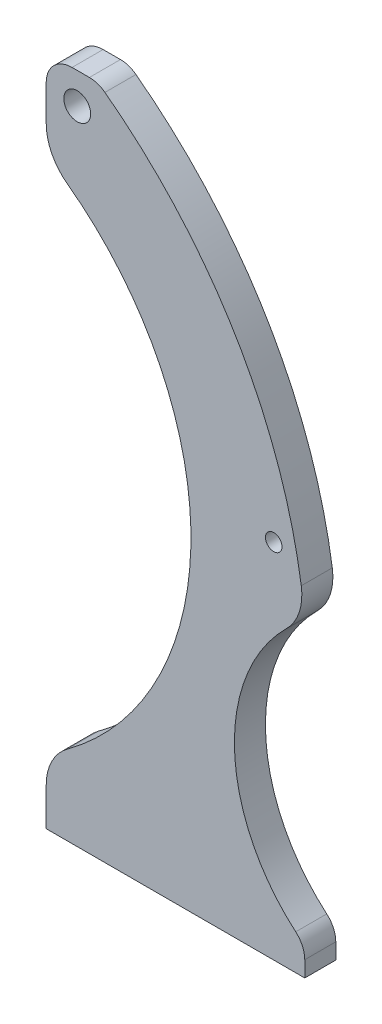
ISO-10303-21;
HEADER;
FILE_DESCRIPTION(('STEP AP214'),'2;1');
FILE_NAME('part.step','',(''),(''),'','','');
FILE_SCHEMA(('AUTOMOTIVE_DESIGN { 1 0 10303 214 1 1 1 1 }'));
ENDSEC;
DATA;
#1=APPLICATION_CONTEXT('core data for automotive mechanical design processes');
#2=APPLICATION_PROTOCOL_DEFINITION('international standard','automotive_design',2000,#1);
#3=PRODUCT_CONTEXT('',#1,'mechanical');
#4=PRODUCT('Part','Part','',(#3));
#5=PRODUCT_RELATED_PRODUCT_CATEGORY('part','',(#4));
#6=PRODUCT_DEFINITION_FORMATION('','',#4);
#7=PRODUCT_DEFINITION_CONTEXT('part definition',#1,'design');
#8=PRODUCT_DEFINITION('design','',#6,#7);
#9=PRODUCT_DEFINITION_SHAPE('','',#8);
#10=(LENGTH_UNIT() NAMED_UNIT(*) SI_UNIT(.MILLI.,.METRE.));
#11=(NAMED_UNIT(*) PLANE_ANGLE_UNIT() SI_UNIT($,.RADIAN.));
#12=(NAMED_UNIT(*) SI_UNIT($,.STERADIAN.) SOLID_ANGLE_UNIT());
#13=UNCERTAINTY_MEASURE_WITH_UNIT(LENGTH_MEASURE(1.E-05),#10,'distance_accuracy_value','');
#14=(GEOMETRIC_REPRESENTATION_CONTEXT(3) GLOBAL_UNCERTAINTY_ASSIGNED_CONTEXT((#13)) GLOBAL_UNIT_ASSIGNED_CONTEXT((#10,
#11,#12)) REPRESENTATION_CONTEXT('',''));
#15=CARTESIAN_POINT('',(0.,0.,0.));
#16=DIRECTION('',(0.,0.,1.));
#17=DIRECTION('',(1.,0.,0.));
#18=AXIS2_PLACEMENT_3D('',#15,#16,#17);
#19=CARTESIAN_POINT('',(22.062235915493,53.975,6.));
#20=DIRECTION('',(-1.,0.,0.));
#21=DIRECTION('',(0.,-1.,0.));
#22=AXIS2_PLACEMENT_3D('',#19,#20,#21);
#23=PLANE('',#22);
#24=DIRECTION('',(0.,1.,0.));
#25=VECTOR('',#24,1.);
#26=CARTESIAN_POINT('',(22.062235915493,53.975,0.));
#27=LINE('',#26,#25);
#28=CARTESIAN_POINT('',(22.062235915493,-76.025,0.));
#29=VERTEX_POINT('',#28);
#30=CARTESIAN_POINT('',(22.062235915493,-72.9630040442354,0.));
#31=VERTEX_POINT('',#30);
#32=EDGE_CURVE('E234',#29,#31,#27,.T.);
#33=ORIENTED_EDGE('',*,*,#32,.T.);
#34=DIRECTION('',(0.,0.,1.));
#35=VECTOR('',#34,1.);
#36=CARTESIAN_POINT('',(22.062235915493,-72.9630040442354,6.));
#37=LINE('',#36,#35);
#38=CARTESIAN_POINT('',(22.062235915493,-72.9630040442354,6.));
#39=VERTEX_POINT('',#38);
#40=EDGE_CURVE('E207',#31,#39,#37,.T.);
#41=ORIENTED_EDGE('',*,*,#40,.T.);
#42=DIRECTION('',(0.,1.,0.));
#43=VECTOR('',#42,1.);
#44=CARTESIAN_POINT('',(22.062235915493,53.975,6.));
#45=LINE('',#44,#43);
#46=CARTESIAN_POINT('',(22.062235915493,-76.025,6.));
#47=VERTEX_POINT('',#46);
#48=EDGE_CURVE('E159',#47,#39,#45,.T.);
#49=ORIENTED_EDGE('',*,*,#48,.F.);
#50=DIRECTION('',(0.,0.,-1.));
#51=VECTOR('',#50,1.);
#52=CARTESIAN_POINT('',(22.062235915493,-76.025,6.));
#53=LINE('',#52,#51);
#54=EDGE_CURVE('E157',#47,#29,#53,.T.);
#55=ORIENTED_EDGE('',*,*,#54,.T.);
#56=EDGE_LOOP('',(#33,#41,#49,#55));
#57=FACE_BOUND('',#56,.T.);
#58=ADVANCED_FACE('F37',(#57),#23,.F.);
#59=CARTESIAN_POINT('',(-27.937764084507,53.975,6.));
#60=DIRECTION('',(1.,0.,0.));
#61=DIRECTION('',(0.,1.,0.));
#62=AXIS2_PLACEMENT_3D('',#59,#60,#61);
#63=PLANE('',#62);
#64=DIRECTION('',(0.,-1.,0.));
#65=VECTOR('',#64,1.);
#66=CARTESIAN_POINT('',(-27.937764084507,53.975,6.));
#67=LINE('',#66,#65);
#68=CARTESIAN_POINT('',(-27.937764084507,48.975,6.));
#69=VERTEX_POINT('',#68);
#70=CARTESIAN_POINT('',(-27.937764084507,42.0916572164017,6.));
#71=VERTEX_POINT('',#70);
#72=EDGE_CURVE('E149',#69,#71,#67,.T.);
#73=ORIENTED_EDGE('',*,*,#72,.F.);
#74=DIRECTION('',(0.,0.,-1.));
#75=VECTOR('',#74,1.);
#76=CARTESIAN_POINT('',(-27.937764084507,48.975,6.));
#77=LINE('',#76,#75);
#78=CARTESIAN_POINT('',(-27.937764084507,48.975,0.));
#79=VERTEX_POINT('',#78);
#80=EDGE_CURVE('E11',#69,#79,#77,.T.);
#81=ORIENTED_EDGE('',*,*,#80,.T.);
#82=DIRECTION('',(0.,-1.,0.));
#83=VECTOR('',#82,1.);
#84=CARTESIAN_POINT('',(-27.937764084507,53.975,0.));
#85=LINE('',#84,#83);
#86=CARTESIAN_POINT('',(-27.937764084507,42.0916572164017,0.));
#87=VERTEX_POINT('',#86);
#88=EDGE_CURVE('E265',#79,#87,#85,.T.);
#89=ORIENTED_EDGE('',*,*,#88,.T.);
#90=DIRECTION('',(0.,0.,1.));
#91=VECTOR('',#90,1.);
#92=CARTESIAN_POINT('',(-27.937764084507,42.0916572164017,6.));
#93=LINE('',#92,#91);
#94=EDGE_CURVE('E198',#87,#71,#93,.T.);
#95=ORIENTED_EDGE('',*,*,#94,.T.);
#96=EDGE_LOOP('',(#73,#81,#89,#95));
#97=FACE_BOUND('',#96,.T.);
#98=ADVANCED_FACE('F296',(#97),#63,.F.);
#99=CARTESIAN_POINT('',(-27.937764084507,-68.7140359331467,6.));
#100=VERTEX_POINT('',#99);
#101=CARTESIAN_POINT('',(-27.937764084507,-76.025,6.));
#102=VERTEX_POINT('',#101);
#103=EDGE_CURVE('E137',#100,#102,#67,.T.);
#104=ORIENTED_EDGE('',*,*,#103,.F.);
#105=DIRECTION('',(0.,0.,1.));
#106=VECTOR('',#105,1.);
#107=CARTESIAN_POINT('',(-27.937764084507,-68.7140359331467,6.));
#108=LINE('',#107,#106);
#109=CARTESIAN_POINT('',(-27.937764084507,-68.7140359331467,0.));
#110=VERTEX_POINT('',#109);
#111=EDGE_CURVE('E189',#100,#110,#108,.F.);
#112=ORIENTED_EDGE('',*,*,#111,.T.);
#113=CARTESIAN_POINT('',(-27.937764084507,-76.025,0.));
#114=VERTEX_POINT('',#113);
#115=EDGE_CURVE('E163',#110,#114,#85,.T.);
#116=ORIENTED_EDGE('',*,*,#115,.T.);
#117=DIRECTION('',(0.,0.,-1.));
#118=VECTOR('',#117,1.);
#119=CARTESIAN_POINT('',(-27.937764084507,-76.025,6.));
#120=LINE('',#119,#118);
#121=EDGE_CURVE('E155',#102,#114,#120,.T.);
#122=ORIENTED_EDGE('',*,*,#121,.F.);
#123=EDGE_LOOP('',(#104,#112,#116,#122));
#124=FACE_BOUND('',#123,.T.);
#125=ADVANCED_FACE('F161',(#124),#63,.F.);
#126=CARTESIAN_POINT('',(-27.937764084507,-76.025,6.));
#127=DIRECTION('',(0.,1.,0.));
#128=DIRECTION('',(0.,0.,1.));
#129=AXIS2_PLACEMENT_3D('',#126,#127,#128);
#130=PLANE('',#129);
#131=DIRECTION('',(1.,0.,0.));
#132=VECTOR('',#131,1.);
#133=CARTESIAN_POINT('',(-27.937764084507,-76.025,0.));
#134=LINE('',#133,#132);
#135=EDGE_CURVE('E267',#114,#29,#134,.T.);
#136=ORIENTED_EDGE('',*,*,#135,.T.);
#137=ORIENTED_EDGE('',*,*,#54,.F.);
#138=DIRECTION('',(1.,0.,0.));
#139=VECTOR('',#138,1.);
#140=CARTESIAN_POINT('',(-27.937764084507,-76.025,6.));
#141=LINE('',#140,#139);
#142=EDGE_CURVE('E142',#102,#47,#141,.T.);
#143=ORIENTED_EDGE('',*,*,#142,.F.);
#144=ORIENTED_EDGE('',*,*,#121,.T.);
#145=EDGE_LOOP('',(#136,#137,#143,#144));
#146=FACE_BOUND('',#145,.T.);
#147=ADVANCED_FACE('F154',(#146),#130,.F.);
#148=CARTESIAN_POINT('',(-27.937764084507,53.975,6.));
#149=DIRECTION('',(0.,-1.,0.));
#150=DIRECTION('',(0.,0.,-1.));
#151=AXIS2_PLACEMENT_3D('',#148,#149,#150);
#152=PLANE('',#151);
#153=DIRECTION('',(-1.,0.,0.));
#154=VECTOR('',#153,1.);
#155=CARTESIAN_POINT('',(-27.937764084507,53.975,6.));
#156=LINE('',#155,#154);
#157=CARTESIAN_POINT('',(-19.5825176191146,53.975,6.));
#158=VERTEX_POINT('',#157);
#159=CARTESIAN_POINT('',(-22.937764084507,53.975,6.));
#160=VERTEX_POINT('',#159);
#161=EDGE_CURVE('E170',#158,#160,#156,.T.);
#162=ORIENTED_EDGE('',*,*,#161,.F.);
#163=DIRECTION('',(0.,0.,1.));
#164=VECTOR('',#163,1.);
#165=CARTESIAN_POINT('',(-19.5825176191146,53.975,6.));
#166=LINE('',#165,#164);
#167=CARTESIAN_POINT('',(-19.5825176191146,53.975,0.));
#168=VERTEX_POINT('',#167);
#169=EDGE_CURVE('E45',#158,#168,#166,.F.);
#170=ORIENTED_EDGE('',*,*,#169,.T.);
#171=DIRECTION('',(-1.,0.,0.));
#172=VECTOR('',#171,1.);
#173=CARTESIAN_POINT('',(-27.937764084507,53.975,0.));
#174=LINE('',#173,#172);
#175=CARTESIAN_POINT('',(-22.937764084507,53.975,0.));
#176=VERTEX_POINT('',#175);
#177=EDGE_CURVE('E150',#168,#176,#174,.T.);
#178=ORIENTED_EDGE('',*,*,#177,.T.);
#179=DIRECTION('',(0.,0.,-1.));
#180=VECTOR('',#179,1.);
#181=CARTESIAN_POINT('',(-22.937764084507,53.975,6.));
#182=LINE('',#181,#180);
#183=EDGE_CURVE('E225',#176,#160,#182,.F.);
#184=ORIENTED_EDGE('',*,*,#183,.T.);
#185=EDGE_LOOP('',(#162,#170,#178,#184));
#186=FACE_BOUND('',#185,.T.);
#187=ADVANCED_FACE('F229',(#186),#152,.F.);
#188=CARTESIAN_POINT('',(-27.937764084507,-76.025,6.));
#189=DIRECTION('',(0.,0.,1.));
#190=DIRECTION('',(1.,0.,0.));
#191=AXIS2_PLACEMENT_3D('',#188,#189,#190);
#192=PLANE('',#191);
#193=ORIENTED_EDGE('',*,*,#48,.T.);
#194=CARTESIAN_POINT('',(17.062235915493,-72.9630040442354,6.));
#195=DIRECTION('',(0.,0.,1.));
#196=DIRECTION('',(1.,0.,0.));
#197=AXIS2_PLACEMENT_3D('',#194,#195,#196);
#198=CIRCLE('',#197,5.);
#199=CARTESIAN_POINT('',(20.3144978066936,-69.1652688519077,6.));
#200=VERTEX_POINT('',#199);
#201=EDGE_CURVE('E214',#39,#200,#198,.T.);
#202=ORIENTED_EDGE('',*,*,#201,.T.);
#203=CARTESIAN_POINT('',(42.3826716236618,-43.3957942097027,6.));
#204=DIRECTION('',(0.,0.,1.));
#205=DIRECTION('',(1.,0.,0.));
#206=AXIS2_PLACEMENT_3D('',#203,#204,#205);
#207=CIRCLE('',#206,33.927424289963);
#208=CARTESIAN_POINT('',(18.5298926392013,-19.2687335998885,6.));
#209=VERTEX_POINT('',#208);
#210=EDGE_CURVE('E243',#209,#200,#207,.T.);
#211=ORIENTED_EDGE('',*,*,#210,.F.);
#212=CARTESIAN_POINT('',(11.499362180832,-12.1573595080592,6.));
#213=DIRECTION('',(0.,0.,1.));
#214=DIRECTION('',(1.,0.,0.));
#215=AXIS2_PLACEMENT_3D('',#212,#213,#214);
#216=CIRCLE('',#215,10.);
#217=CARTESIAN_POINT('',(21.3880484690442,-10.6694470464795,6.));
#218=VERTEX_POINT('',#217);
#219=EDGE_CURVE('E183',#209,#218,#216,.T.);
#220=ORIENTED_EDGE('',*,*,#219,.T.);
#221=CARTESIAN_POINT('',(-75.3284238367945,-25.2220013686268,6.));
#222=DIRECTION('',(0.,0.,-1.));
#223=DIRECTION('',(-1.,0.,0.));
#224=AXIS2_PLACEMENT_3D('',#221,#222,#223);
#225=CIRCLE('',#224,97.8051780458739);
#226=CARTESIAN_POINT('',(-16.5791342200696,52.9724602134781,6.));
#227=VERTEX_POINT('',#226);
#228=EDGE_CURVE('E240',#227,#218,#225,.T.);
#229=ORIENTED_EDGE('',*,*,#228,.F.);
#230=CARTESIAN_POINT('',(-19.5825176191146,48.975,6.));
#231=DIRECTION('',(0.,0.,1.));
#232=DIRECTION('',(1.,0.,0.));
#233=AXIS2_PLACEMENT_3D('',#230,#231,#232);
#234=CIRCLE('',#233,5.);
#235=EDGE_CURVE('E212',#227,#158,#234,.T.);
#236=ORIENTED_EDGE('',*,*,#235,.T.);
#237=ORIENTED_EDGE('',*,*,#161,.T.);
#238=CARTESIAN_POINT('',(-22.937764084507,48.975,6.));
#239=DIRECTION('',(0.,0.,1.));
#240=DIRECTION('',(1.,0.,0.));
#241=AXIS2_PLACEMENT_3D('',#238,#239,#240);
#242=CIRCLE('',#241,5.);
#243=EDGE_CURVE('E210',#160,#69,#242,.T.);
#244=ORIENTED_EDGE('',*,*,#243,.T.);
#245=ORIENTED_EDGE('',*,*,#72,.T.);
#246=CARTESIAN_POINT('',(-17.937764084507,42.0916572164017,6.));
#247=DIRECTION('',(0.,0.,1.));
#248=DIRECTION('',(1.,0.,0.));
#249=AXIS2_PLACEMENT_3D('',#246,#247,#248);
#250=CIRCLE('',#249,10.);
#251=CARTESIAN_POINT('',(-23.8712225627383,34.0421808056589,6.));
#252=VERTEX_POINT('',#251);
#253=EDGE_CURVE('E186',#71,#252,#250,.T.);
#254=ORIENTED_EDGE('',*,*,#253,.T.);
#255=CARTESIAN_POINT('',(-58.7765060042316,-13.3111893583725,6.));
#256=DIRECTION('',(0.,0.,1.));
#257=DIRECTION('',(1.,0.,0.));
#258=AXIS2_PLACEMENT_3D('',#255,#256,#257);
#259=CIRCLE('',#258,58.8278886075538);
#260=CARTESIAN_POINT('',(-23.8712225627383,-60.6645595224038,6.));
#261=VERTEX_POINT('',#260);
#262=EDGE_CURVE('E246',#261,#252,#259,.T.);
#263=ORIENTED_EDGE('',*,*,#262,.F.);
#264=CARTESIAN_POINT('',(-17.937764084507,-68.7140359331467,6.));
#265=DIRECTION('',(0.,0.,1.));
#266=DIRECTION('',(1.,0.,0.));
#267=AXIS2_PLACEMENT_3D('',#264,#265,#266);
#268=CIRCLE('',#267,10.);
#269=EDGE_CURVE('E145',#261,#100,#268,.T.);
#270=ORIENTED_EDGE('',*,*,#269,.T.);
#271=ORIENTED_EDGE('',*,*,#103,.T.);
#272=ORIENTED_EDGE('',*,*,#142,.T.);
#273=EDGE_LOOP('',(#193,#202,#211,#220,#229,#236,#237,#244,#245,#254,#263,#270,#271,#272));
#274=FACE_BOUND('',#273,.T.);
#275=CARTESIAN_POINT('',(16.062235915493,-6.025,6.));
#276=DIRECTION('',(0.,0.,1.));
#277=DIRECTION('',(1.,0.,0.));
#278=AXIS2_PLACEMENT_3D('',#275,#276,#277);
#279=CIRCLE('',#278,1.6);
#280=CARTESIAN_POINT('',(17.662235915493,-6.025,6.));
#281=VERTEX_POINT('',#280);
#282=EDGE_CURVE('E251',#281,#281,#279,.T.);
#283=ORIENTED_EDGE('',*,*,#282,.F.);
#284=EDGE_LOOP('',(#283));
#285=FACE_BOUND('',#284,.T.);
#286=CARTESIAN_POINT('',(-21.937764084507,47.975,6.));
#287=DIRECTION('',(0.,0.,1.));
#288=DIRECTION('',(1.,0.,0.));
#289=AXIS2_PLACEMENT_3D('',#286,#287,#288);
#290=CIRCLE('',#289,2.6);
#291=CARTESIAN_POINT('',(-19.337764084507,47.975,6.));
#292=VERTEX_POINT('',#291);
#293=EDGE_CURVE('E255',#292,#292,#290,.T.);
#294=ORIENTED_EDGE('',*,*,#293,.F.);
#295=EDGE_LOOP('',(#294));
#296=FACE_BOUND('',#295,.T.);
#297=ADVANCED_FACE('F140',(#274,#285,#296),#192,.T.);
#298=CARTESIAN_POINT('',(-27.937764084507,-76.025,0.));
#299=DIRECTION('',(0.,0.,1.));
#300=DIRECTION('',(1.,0.,0.));
#301=AXIS2_PLACEMENT_3D('',#298,#299,#300);
#302=PLANE('',#301);
#303=CARTESIAN_POINT('',(16.062235915493,-6.025,0.));
#304=DIRECTION('',(0.,0.,1.));
#305=DIRECTION('',(1.,0.,0.));
#306=AXIS2_PLACEMENT_3D('',#303,#304,#305);
#307=CIRCLE('',#306,1.6);
#308=CARTESIAN_POINT('',(17.662235915493,-6.025,0.));
#309=VERTEX_POINT('',#308);
#310=EDGE_CURVE('E252',#309,#309,#307,.T.);
#311=ORIENTED_EDGE('',*,*,#310,.T.);
#312=EDGE_LOOP('',(#311));
#313=FACE_BOUND('',#312,.T.);
#314=CARTESIAN_POINT('',(-21.937764084507,47.975,0.));
#315=DIRECTION('',(0.,0.,1.));
#316=DIRECTION('',(1.,0.,0.));
#317=AXIS2_PLACEMENT_3D('',#314,#315,#316);
#318=CIRCLE('',#317,2.6);
#319=CARTESIAN_POINT('',(-19.337764084507,47.975,0.));
#320=VERTEX_POINT('',#319);
#321=EDGE_CURVE('E258',#320,#320,#318,.T.);
#322=ORIENTED_EDGE('',*,*,#321,.T.);
#323=EDGE_LOOP('',(#322));
#324=FACE_BOUND('',#323,.T.);
#325=CARTESIAN_POINT('',(42.3826716236618,-43.3957942097027,0.));
#326=DIRECTION('',(0.,0.,1.));
#327=DIRECTION('',(1.,0.,0.));
#328=AXIS2_PLACEMENT_3D('',#325,#326,#327);
#329=CIRCLE('',#328,33.927424289963);
#330=CARTESIAN_POINT('',(18.5298926392013,-19.2687335998885,0.));
#331=VERTEX_POINT('',#330);
#332=CARTESIAN_POINT('',(20.3144978066936,-69.1652688519077,0.));
#333=VERTEX_POINT('',#332);
#334=EDGE_CURVE('E168',#331,#333,#329,.T.);
#335=ORIENTED_EDGE('',*,*,#334,.T.);
#336=CARTESIAN_POINT('',(17.062235915493,-72.9630040442354,0.));
#337=DIRECTION('',(0.,0.,1.));
#338=DIRECTION('',(1.,0.,0.));
#339=AXIS2_PLACEMENT_3D('',#336,#337,#338);
#340=CIRCLE('',#339,5.);
#341=EDGE_CURVE('E220',#333,#31,#340,.F.);
#342=ORIENTED_EDGE('',*,*,#341,.T.);
#343=ORIENTED_EDGE('',*,*,#32,.F.);
#344=ORIENTED_EDGE('',*,*,#135,.F.);
#345=ORIENTED_EDGE('',*,*,#115,.F.);
#346=CARTESIAN_POINT('',(-17.937764084507,-68.7140359331467,0.));
#347=DIRECTION('',(0.,0.,1.));
#348=DIRECTION('',(1.,0.,0.));
#349=AXIS2_PLACEMENT_3D('',#346,#347,#348);
#350=CIRCLE('',#349,10.);
#351=CARTESIAN_POINT('',(-23.8712225627383,-60.6645595224038,0.));
#352=VERTEX_POINT('',#351);
#353=EDGE_CURVE('E196',#110,#352,#350,.F.);
#354=ORIENTED_EDGE('',*,*,#353,.T.);
#355=CARTESIAN_POINT('',(-58.7765060042316,-13.3111893583725,0.));
#356=DIRECTION('',(0.,0.,1.));
#357=DIRECTION('',(1.,0.,0.));
#358=AXIS2_PLACEMENT_3D('',#355,#356,#357);
#359=CIRCLE('',#358,58.8278886075538);
#360=CARTESIAN_POINT('',(-23.8712225627383,34.0421808056589,0.));
#361=VERTEX_POINT('',#360);
#362=EDGE_CURVE('E165',#352,#361,#359,.T.);
#363=ORIENTED_EDGE('',*,*,#362,.T.);
#364=CARTESIAN_POINT('',(-17.937764084507,42.0916572164017,0.));
#365=DIRECTION('',(0.,0.,1.));
#366=DIRECTION('',(1.,0.,0.));
#367=AXIS2_PLACEMENT_3D('',#364,#365,#366);
#368=CIRCLE('',#367,10.);
#369=EDGE_CURVE('E193',#361,#87,#368,.F.);
#370=ORIENTED_EDGE('',*,*,#369,.T.);
#371=ORIENTED_EDGE('',*,*,#88,.F.);
#372=CARTESIAN_POINT('',(-22.937764084507,48.975,0.));
#373=DIRECTION('',(0.,0.,1.));
#374=DIRECTION('',(1.,0.,0.));
#375=AXIS2_PLACEMENT_3D('',#372,#373,#374);
#376=CIRCLE('',#375,5.);
#377=EDGE_CURVE('E58',#79,#176,#376,.F.);
#378=ORIENTED_EDGE('',*,*,#377,.T.);
#379=ORIENTED_EDGE('',*,*,#177,.F.);
#380=CARTESIAN_POINT('',(-19.5825176191146,48.975,0.));
#381=DIRECTION('',(0.,0.,1.));
#382=DIRECTION('',(1.,0.,0.));
#383=AXIS2_PLACEMENT_3D('',#380,#381,#382);
#384=CIRCLE('',#383,5.);
#385=CARTESIAN_POINT('',(-16.5791342200696,52.9724602134781,0.));
#386=VERTEX_POINT('',#385);
#387=EDGE_CURVE('E52',#168,#386,#384,.F.);
#388=ORIENTED_EDGE('',*,*,#387,.T.);
#389=CARTESIAN_POINT('',(-75.3284238367945,-25.2220013686268,0.));
#390=DIRECTION('',(0.,0.,1.));
#391=DIRECTION('',(1.,0.,0.));
#392=AXIS2_PLACEMENT_3D('',#389,#390,#391);
#393=CIRCLE('',#392,97.8051780458739);
#394=CARTESIAN_POINT('',(21.3880484690442,-10.6694470464795,0.));
#395=VERTEX_POINT('',#394);
#396=EDGE_CURVE('E176',#386,#395,#393,.F.);
#397=ORIENTED_EDGE('',*,*,#396,.T.);
#398=CARTESIAN_POINT('',(11.499362180832,-12.1573595080592,0.));
#399=DIRECTION('',(0.,0.,1.));
#400=DIRECTION('',(1.,0.,0.));
#401=AXIS2_PLACEMENT_3D('',#398,#399,#400);
#402=CIRCLE('',#401,10.);
#403=EDGE_CURVE('E191',#395,#331,#402,.F.);
#404=ORIENTED_EDGE('',*,*,#403,.T.);
#405=EDGE_LOOP('',(#335,#342,#343,#344,#345,#354,#363,#370,#371,#378,#379,#388,#397,#404));
#406=FACE_BOUND('',#405,.T.);
#407=ADVANCED_FACE('F233',(#313,#324,#406),#302,.F.);
#408=CARTESIAN_POINT('',(-21.937764084507,47.975,0.));
#409=DIRECTION('',(0.,0.,1.));
#410=DIRECTION('',(1.,0.,0.));
#411=AXIS2_PLACEMENT_3D('',#408,#409,#410);
#412=CYLINDRICAL_SURFACE('',#411,2.6);
#413=ORIENTED_EDGE('',*,*,#321,.F.);
#414=EDGE_LOOP('',(#413));
#415=FACE_BOUND('',#414,.T.);
#416=ORIENTED_EDGE('',*,*,#293,.T.);
#417=EDGE_LOOP('',(#416));
#418=FACE_BOUND('',#417,.T.);
#419=ADVANCED_FACE('F368',(#415,#418),#412,.F.);
#420=CARTESIAN_POINT('',(16.062235915493,-6.025,0.));
#421=DIRECTION('',(0.,0.,1.));
#422=DIRECTION('',(1.,0.,0.));
#423=AXIS2_PLACEMENT_3D('',#420,#421,#422);
#424=CYLINDRICAL_SURFACE('',#423,1.6);
#425=ORIENTED_EDGE('',*,*,#310,.F.);
#426=EDGE_LOOP('',(#425));
#427=FACE_BOUND('',#426,.T.);
#428=ORIENTED_EDGE('',*,*,#282,.T.);
#429=EDGE_LOOP('',(#428));
#430=FACE_BOUND('',#429,.T.);
#431=ADVANCED_FACE('F423',(#427,#430),#424,.F.);
#432=CARTESIAN_POINT('',(-58.7765060042316,-13.3111893583725,-14.));
#433=DIRECTION('',(0.,0.,1.));
#434=DIRECTION('',(1.,0.,0.));
#435=AXIS2_PLACEMENT_3D('',#432,#433,#434);
#436=CYLINDRICAL_SURFACE('',#435,58.8278886075538);
#437=ORIENTED_EDGE('',*,*,#362,.F.);
#438=DIRECTION('',(0.,0.,1.));
#439=VECTOR('',#438,1.);
#440=CARTESIAN_POINT('',(-23.8712225627383,-60.6645595224038,-14.));
#441=LINE('',#440,#439);
#442=EDGE_CURVE('E180',#352,#261,#441,.T.);
#443=ORIENTED_EDGE('',*,*,#442,.T.);
#444=ORIENTED_EDGE('',*,*,#262,.T.);
#445=DIRECTION('',(0.,0.,1.));
#446=VECTOR('',#445,1.);
#447=CARTESIAN_POINT('',(-23.8712225627383,34.0421808056589,-14.));
#448=LINE('',#447,#446);
#449=EDGE_CURVE('E178',#252,#361,#448,.F.);
#450=ORIENTED_EDGE('',*,*,#449,.T.);
#451=EDGE_LOOP('',(#437,#443,#444,#450));
#452=FACE_BOUND('',#451,.T.);
#453=ADVANCED_FACE('F320',(#452),#436,.F.);
#454=CARTESIAN_POINT('',(-75.3284238367945,-25.2220013686268,-14.));
#455=DIRECTION('',(0.,0.,1.));
#456=DIRECTION('',(1.,0.,0.));
#457=AXIS2_PLACEMENT_3D('',#454,#455,#456);
#458=CYLINDRICAL_SURFACE('',#457,97.8051780458739);
#459=ORIENTED_EDGE('',*,*,#396,.F.);
#460=DIRECTION('',(0.,0.,1.));
#461=VECTOR('',#460,1.);
#462=CARTESIAN_POINT('',(-16.5791342200696,52.9724602134781,-14.));
#463=LINE('',#462,#461);
#464=EDGE_CURVE('E222',#386,#227,#463,.T.);
#465=ORIENTED_EDGE('',*,*,#464,.T.);
#466=ORIENTED_EDGE('',*,*,#228,.T.);
#467=DIRECTION('',(0.,0.,1.));
#468=VECTOR('',#467,1.);
#469=CARTESIAN_POINT('',(21.3880484690442,-10.6694470464795,-14.));
#470=LINE('',#469,#468);
#471=EDGE_CURVE('E204',#218,#395,#470,.F.);
#472=ORIENTED_EDGE('',*,*,#471,.T.);
#473=EDGE_LOOP('',(#459,#465,#466,#472));
#474=FACE_BOUND('',#473,.T.);
#475=ADVANCED_FACE('F239',(#474),#458,.T.);
#476=CARTESIAN_POINT('',(42.3826716236618,-43.3957942097027,-14.));
#477=DIRECTION('',(0.,0.,1.));
#478=DIRECTION('',(1.,0.,0.));
#479=AXIS2_PLACEMENT_3D('',#476,#477,#478);
#480=CYLINDRICAL_SURFACE('',#479,33.927424289963);
#481=ORIENTED_EDGE('',*,*,#210,.T.);
#482=DIRECTION('',(0.,0.,1.));
#483=VECTOR('',#482,1.);
#484=CARTESIAN_POINT('',(20.3144978066936,-69.1652688519077,-14.));
#485=LINE('',#484,#483);
#486=EDGE_CURVE('E216',#200,#333,#485,.F.);
#487=ORIENTED_EDGE('',*,*,#486,.T.);
#488=ORIENTED_EDGE('',*,*,#334,.F.);
#489=DIRECTION('',(0.,0.,1.));
#490=VECTOR('',#489,1.);
#491=CARTESIAN_POINT('',(18.5298926392013,-19.2687335998885,-14.));
#492=LINE('',#491,#490);
#493=EDGE_CURVE('E201',#331,#209,#492,.T.);
#494=ORIENTED_EDGE('',*,*,#493,.T.);
#495=EDGE_LOOP('',(#481,#487,#488,#494));
#496=FACE_BOUND('',#495,.T.);
#497=ADVANCED_FACE('F278',(#496),#480,.F.);
#498=CARTESIAN_POINT('',(-17.937764084507,-68.7140359331467,-14.));
#499=DIRECTION('',(0.,0.,1.));
#500=DIRECTION('',(1.,0.,0.));
#501=AXIS2_PLACEMENT_3D('',#498,#499,#500);
#502=CYLINDRICAL_SURFACE('',#501,10.);
#503=ORIENTED_EDGE('',*,*,#353,.F.);
#504=ORIENTED_EDGE('',*,*,#111,.F.);
#505=ORIENTED_EDGE('',*,*,#269,.F.);
#506=ORIENTED_EDGE('',*,*,#442,.F.);
#507=EDGE_LOOP('',(#503,#504,#505,#506));
#508=FACE_BOUND('',#507,.T.);
#509=ADVANCED_FACE('F292',(#508),#502,.T.);
#510=CARTESIAN_POINT('',(-17.937764084507,42.0916572164017,-14.));
#511=DIRECTION('',(0.,0.,1.));
#512=DIRECTION('',(1.,0.,0.));
#513=AXIS2_PLACEMENT_3D('',#510,#511,#512);
#514=CYLINDRICAL_SURFACE('',#513,10.);
#515=ORIENTED_EDGE('',*,*,#369,.F.);
#516=ORIENTED_EDGE('',*,*,#449,.F.);
#517=ORIENTED_EDGE('',*,*,#253,.F.);
#518=ORIENTED_EDGE('',*,*,#94,.F.);
#519=EDGE_LOOP('',(#515,#516,#517,#518));
#520=FACE_BOUND('',#519,.T.);
#521=ADVANCED_FACE('F285',(#520),#514,.T.);
#522=CARTESIAN_POINT('',(11.499362180832,-12.1573595080592,-14.));
#523=DIRECTION('',(0.,0.,-1.));
#524=DIRECTION('',(-1.,0.,0.));
#525=AXIS2_PLACEMENT_3D('',#522,#523,#524);
#526=CYLINDRICAL_SURFACE('',#525,10.);
#527=ORIENTED_EDGE('',*,*,#403,.F.);
#528=ORIENTED_EDGE('',*,*,#471,.F.);
#529=ORIENTED_EDGE('',*,*,#219,.F.);
#530=ORIENTED_EDGE('',*,*,#493,.F.);
#531=EDGE_LOOP('',(#527,#528,#529,#530));
#532=FACE_BOUND('',#531,.T.);
#533=ADVANCED_FACE('F283',(#532),#526,.T.);
#534=CARTESIAN_POINT('',(17.062235915493,-72.9630040442354,-14.));
#535=DIRECTION('',(0.,0.,1.));
#536=DIRECTION('',(1.,0.,0.));
#537=AXIS2_PLACEMENT_3D('',#534,#535,#536);
#538=CYLINDRICAL_SURFACE('',#537,5.);
#539=ORIENTED_EDGE('',*,*,#341,.F.);
#540=ORIENTED_EDGE('',*,*,#486,.F.);
#541=ORIENTED_EDGE('',*,*,#201,.F.);
#542=ORIENTED_EDGE('',*,*,#40,.F.);
#543=EDGE_LOOP('',(#539,#540,#541,#542));
#544=FACE_BOUND('',#543,.T.);
#545=ADVANCED_FACE('F275',(#544),#538,.T.);
#546=CARTESIAN_POINT('',(-19.5825176191146,48.975,-14.));
#547=DIRECTION('',(0.,0.,1.));
#548=DIRECTION('',(1.,0.,0.));
#549=AXIS2_PLACEMENT_3D('',#546,#547,#548);
#550=CYLINDRICAL_SURFACE('',#549,5.);
#551=ORIENTED_EDGE('',*,*,#387,.F.);
#552=ORIENTED_EDGE('',*,*,#169,.F.);
#553=ORIENTED_EDGE('',*,*,#235,.F.);
#554=ORIENTED_EDGE('',*,*,#464,.F.);
#555=EDGE_LOOP('',(#551,#552,#553,#554));
#556=FACE_BOUND('',#555,.T.);
#557=ADVANCED_FACE('F236',(#556),#550,.T.);
#558=CARTESIAN_POINT('',(-22.937764084507,48.975,6.));
#559=DIRECTION('',(0.,0.,-1.));
#560=DIRECTION('',(-1.,0.,0.));
#561=AXIS2_PLACEMENT_3D('',#558,#559,#560);
#562=CYLINDRICAL_SURFACE('',#561,5.);
#563=ORIENTED_EDGE('',*,*,#243,.F.);
#564=ORIENTED_EDGE('',*,*,#183,.F.);
#565=ORIENTED_EDGE('',*,*,#377,.F.);
#566=ORIENTED_EDGE('',*,*,#80,.F.);
#567=EDGE_LOOP('',(#563,#564,#565,#566));
#568=FACE_BOUND('',#567,.T.);
#569=ADVANCED_FACE('F39',(#568),#562,.T.);
#570=CLOSED_SHELL('',(#58,#98,#125,#147,#187,#297,#407,#419,#431,#453,#475,#497,#509,#521,#533,
#545,#557,#569));
#571=MANIFOLD_SOLID_BREP('B2',#570);
#572=ADVANCED_BREP_SHAPE_REPRESENTATION('',(#18,#571),#14);
#573=SHAPE_DEFINITION_REPRESENTATION(#9,#572);
ENDSEC;
END-ISO-10303-21;
